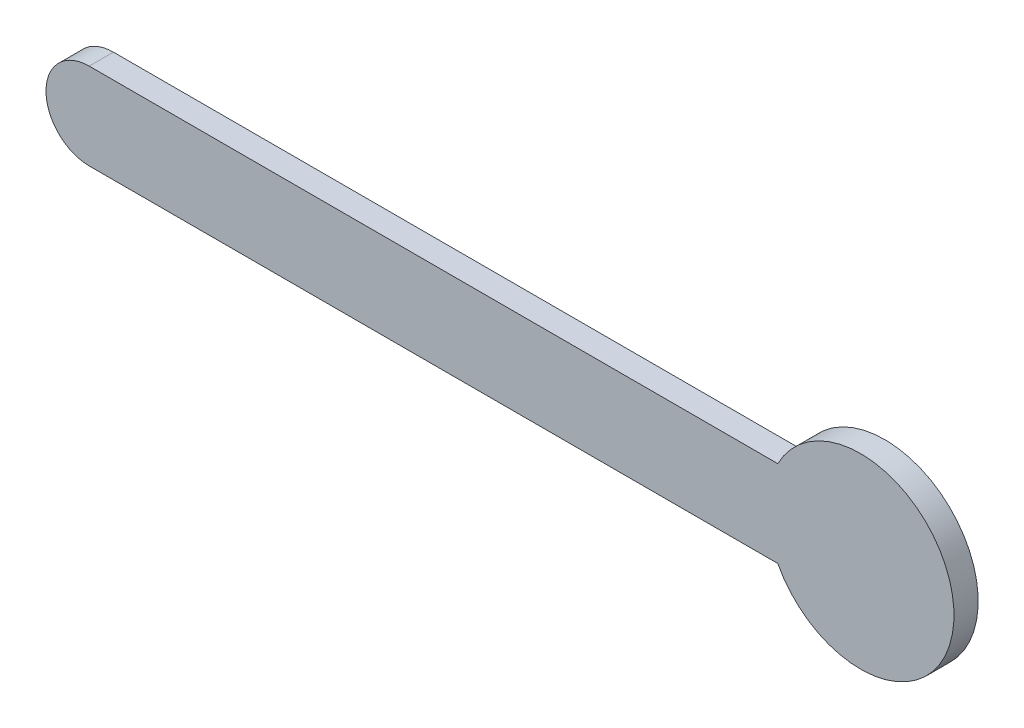
ISO-10303-21;
HEADER;
FILE_DESCRIPTION(('STEP AP214'),'2;1');
FILE_NAME('part.step','',(''),(''),'','','');
FILE_SCHEMA(('AUTOMOTIVE_DESIGN { 1 0 10303 214 1 1 1 1 }'));
ENDSEC;
DATA;
#1=APPLICATION_CONTEXT('core data for automotive mechanical design processes');
#2=APPLICATION_PROTOCOL_DEFINITION('international standard','automotive_design',2000,#1);
#3=PRODUCT_CONTEXT('',#1,'mechanical');
#4=PRODUCT('Part','Part','',(#3));
#5=PRODUCT_RELATED_PRODUCT_CATEGORY('part','',(#4));
#6=PRODUCT_DEFINITION_FORMATION('','',#4);
#7=PRODUCT_DEFINITION_CONTEXT('part definition',#1,'design');
#8=PRODUCT_DEFINITION('design','',#6,#7);
#9=PRODUCT_DEFINITION_SHAPE('','',#8);
#10=(LENGTH_UNIT() NAMED_UNIT(*) SI_UNIT(.MILLI.,.METRE.));
#11=(NAMED_UNIT(*) PLANE_ANGLE_UNIT() SI_UNIT($,.RADIAN.));
#12=(NAMED_UNIT(*) SI_UNIT($,.STERADIAN.) SOLID_ANGLE_UNIT());
#13=UNCERTAINTY_MEASURE_WITH_UNIT(LENGTH_MEASURE(1.E-05),#10,'distance_accuracy_value','');
#14=(GEOMETRIC_REPRESENTATION_CONTEXT(3) GLOBAL_UNCERTAINTY_ASSIGNED_CONTEXT((#13)) GLOBAL_UNIT_ASSIGNED_CONTEXT((#10,
#11,#12)) REPRESENTATION_CONTEXT('',''));
#15=CARTESIAN_POINT('',(0.,0.,0.));
#16=DIRECTION('',(0.,0.,1.));
#17=DIRECTION('',(1.,0.,0.));
#18=AXIS2_PLACEMENT_3D('',#15,#16,#17);
#19=CARTESIAN_POINT('',(0.,0.,7.));
#20=DIRECTION('',(0.,0.,-1.));
#21=DIRECTION('',(-1.,0.,0.));
#22=AXIS2_PLACEMENT_3D('',#19,#20,#21);
#23=CYLINDRICAL_SURFACE('',#22,12.5);
#24=CARTESIAN_POINT('',(0.,0.,0.));
#25=DIRECTION('',(0.,0.,1.));
#26=DIRECTION('',(1.,0.,0.));
#27=AXIS2_PLACEMENT_3D('',#24,#25,#26);
#28=CIRCLE('',#27,12.5);
#29=CARTESIAN_POINT('',(0.,12.5,0.));
#30=VERTEX_POINT('',#29);
#31=CARTESIAN_POINT('',(0.,-12.5,0.));
#32=VERTEX_POINT('',#31);
#33=EDGE_CURVE('E99',#30,#32,#28,.T.);
#34=ORIENTED_EDGE('',*,*,#33,.T.);
#35=DIRECTION('',(0.,0.,-1.));
#36=VECTOR('',#35,1.);
#37=CARTESIAN_POINT('',(0.,-12.5,7.));
#38=LINE('',#37,#36);
#39=CARTESIAN_POINT('',(0.,-12.5,7.));
#40=VERTEX_POINT('',#39);
#41=EDGE_CURVE('E11',#40,#32,#38,.T.);
#42=ORIENTED_EDGE('',*,*,#41,.F.);
#43=CARTESIAN_POINT('',(0.,0.,7.));
#44=DIRECTION('',(0.,0.,1.));
#45=DIRECTION('',(1.,0.,0.));
#46=AXIS2_PLACEMENT_3D('',#43,#44,#45);
#47=CIRCLE('',#46,12.5);
#48=CARTESIAN_POINT('',(0.,12.5,7.));
#49=VERTEX_POINT('',#48);
#50=EDGE_CURVE('E87',#49,#40,#47,.T.);
#51=ORIENTED_EDGE('',*,*,#50,.F.);
#52=DIRECTION('',(0.,0.,-1.));
#53=VECTOR('',#52,1.);
#54=CARTESIAN_POINT('',(0.,12.5,7.));
#55=LINE('',#54,#53);
#56=EDGE_CURVE('E95',#49,#30,#55,.T.);
#57=ORIENTED_EDGE('',*,*,#56,.T.);
#58=EDGE_LOOP('',(#34,#42,#51,#57));
#59=FACE_BOUND('',#58,.T.);
#60=ADVANCED_FACE('F36',(#59),#23,.T.);
#61=CARTESIAN_POINT('',(0.,-12.5,7.));
#62=DIRECTION('',(0.,1.,0.));
#63=DIRECTION('',(0.,0.,1.));
#64=AXIS2_PLACEMENT_3D('',#61,#62,#63);
#65=PLANE('',#64);
#66=DIRECTION('',(1.,0.,0.));
#67=VECTOR('',#66,1.);
#68=CARTESIAN_POINT('',(0.,-12.5,0.));
#69=LINE('',#68,#67);
#70=CARTESIAN_POINT('',(199.067804112451,-12.5,0.));
#71=VERTEX_POINT('',#70);
#72=EDGE_CURVE('E91',#32,#71,#69,.T.);
#73=ORIENTED_EDGE('',*,*,#72,.T.);
#74=DIRECTION('',(0.,0.,-1.));
#75=VECTOR('',#74,1.);
#76=CARTESIAN_POINT('',(199.067804112451,-12.5,7.));
#77=LINE('',#76,#75);
#78=CARTESIAN_POINT('',(199.067804112451,-12.5,7.));
#79=VERTEX_POINT('',#78);
#80=EDGE_CURVE('E44',#79,#71,#77,.T.);
#81=ORIENTED_EDGE('',*,*,#80,.F.);
#82=DIRECTION('',(1.,0.,0.));
#83=VECTOR('',#82,1.);
#84=CARTESIAN_POINT('',(0.,-12.5,7.));
#85=LINE('',#84,#83);
#86=EDGE_CURVE('E82',#40,#79,#85,.T.);
#87=ORIENTED_EDGE('',*,*,#86,.F.);
#88=ORIENTED_EDGE('',*,*,#41,.T.);
#89=EDGE_LOOP('',(#73,#81,#87,#88));
#90=FACE_BOUND('',#89,.T.);
#91=ADVANCED_FACE('F90',(#90),#65,.F.);
#92=CARTESIAN_POINT('',(223.,0.,7.));
#93=DIRECTION('',(0.,0.,-1.));
#94=DIRECTION('',(-1.,0.,0.));
#95=AXIS2_PLACEMENT_3D('',#92,#93,#94);
#96=CYLINDRICAL_SURFACE('',#95,27.);
#97=CARTESIAN_POINT('',(223.,0.,0.));
#98=DIRECTION('',(0.,0.,1.));
#99=DIRECTION('',(1.,0.,0.));
#100=AXIS2_PLACEMENT_3D('',#97,#98,#99);
#101=CIRCLE('',#100,27.);
#102=CARTESIAN_POINT('',(199.067804112451,12.5,0.));
#103=VERTEX_POINT('',#102);
#104=EDGE_CURVE('E69',#71,#103,#101,.T.);
#105=ORIENTED_EDGE('',*,*,#104,.T.);
#106=DIRECTION('',(0.,0.,-1.));
#107=VECTOR('',#106,1.);
#108=CARTESIAN_POINT('',(199.067804112451,12.5,7.));
#109=LINE('',#108,#107);
#110=CARTESIAN_POINT('',(199.067804112451,12.5,7.));
#111=VERTEX_POINT('',#110);
#112=EDGE_CURVE('E92',#111,#103,#109,.T.);
#113=ORIENTED_EDGE('',*,*,#112,.F.);
#114=CARTESIAN_POINT('',(223.,0.,7.));
#115=DIRECTION('',(0.,0.,1.));
#116=DIRECTION('',(1.,0.,0.));
#117=AXIS2_PLACEMENT_3D('',#114,#115,#116);
#118=CIRCLE('',#117,27.);
#119=EDGE_CURVE('E85',#79,#111,#118,.T.);
#120=ORIENTED_EDGE('',*,*,#119,.F.);
#121=ORIENTED_EDGE('',*,*,#80,.T.);
#122=EDGE_LOOP('',(#105,#113,#120,#121));
#123=FACE_BOUND('',#122,.T.);
#124=ADVANCED_FACE('F93',(#123),#96,.T.);
#125=CARTESIAN_POINT('',(0.,12.5,7.));
#126=DIRECTION('',(0.,-1.,0.));
#127=DIRECTION('',(0.,0.,-1.));
#128=AXIS2_PLACEMENT_3D('',#125,#126,#127);
#129=PLANE('',#128);
#130=DIRECTION('',(-1.,0.,0.));
#131=VECTOR('',#130,1.);
#132=CARTESIAN_POINT('',(0.,12.5,0.));
#133=LINE('',#132,#131);
#134=EDGE_CURVE('E75',#103,#30,#133,.T.);
#135=ORIENTED_EDGE('',*,*,#134,.T.);
#136=ORIENTED_EDGE('',*,*,#56,.F.);
#137=DIRECTION('',(-1.,0.,0.));
#138=VECTOR('',#137,1.);
#139=CARTESIAN_POINT('',(0.,12.5,7.));
#140=LINE('',#139,#138);
#141=EDGE_CURVE('E52',#111,#49,#140,.T.);
#142=ORIENTED_EDGE('',*,*,#141,.F.);
#143=ORIENTED_EDGE('',*,*,#112,.T.);
#144=EDGE_LOOP('',(#135,#136,#142,#143));
#145=FACE_BOUND('',#144,.T.);
#146=ADVANCED_FACE('F106',(#145),#129,.F.);
#147=CARTESIAN_POINT('',(0.,0.,7.));
#148=DIRECTION('',(0.,0.,1.));
#149=DIRECTION('',(1.,0.,0.));
#150=AXIS2_PLACEMENT_3D('',#147,#148,#149);
#151=PLANE('',#150);
#152=ORIENTED_EDGE('',*,*,#50,.T.);
#153=ORIENTED_EDGE('',*,*,#86,.T.);
#154=ORIENTED_EDGE('',*,*,#119,.T.);
#155=ORIENTED_EDGE('',*,*,#141,.T.);
#156=EDGE_LOOP('',(#152,#153,#154,#155));
#157=FACE_BOUND('',#156,.T.);
#158=ADVANCED_FACE('F83',(#157),#151,.T.);
#159=CARTESIAN_POINT('',(0.,0.,0.));
#160=DIRECTION('',(0.,0.,1.));
#161=DIRECTION('',(1.,0.,0.));
#162=AXIS2_PLACEMENT_3D('',#159,#160,#161);
#163=PLANE('',#162);
#164=ORIENTED_EDGE('',*,*,#33,.F.);
#165=ORIENTED_EDGE('',*,*,#134,.F.);
#166=ORIENTED_EDGE('',*,*,#104,.F.);
#167=ORIENTED_EDGE('',*,*,#72,.F.);
#168=EDGE_LOOP('',(#164,#165,#166,#167));
#169=FACE_BOUND('',#168,.T.);
#170=ADVANCED_FACE('F109',(#169),#163,.F.);
#171=CLOSED_SHELL('',(#60,#91,#124,#146,#158,#170));
#172=MANIFOLD_SOLID_BREP('B2',#171);
#173=ADVANCED_BREP_SHAPE_REPRESENTATION('',(#18,#172),#14);
#174=SHAPE_DEFINITION_REPRESENTATION(#9,#173);
ENDSEC;
END-ISO-10303-21;
